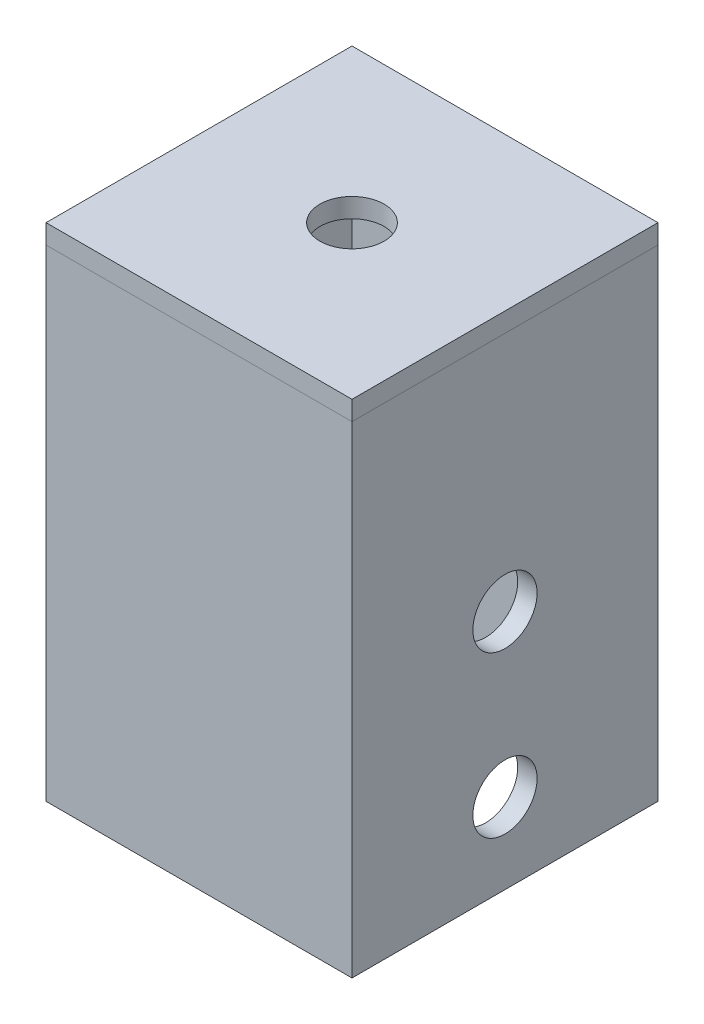
ISO-10303-21;
HEADER;
FILE_DESCRIPTION(('STEP AP214'),'2;1');
FILE_NAME('part.step','',(''),(''),'','','');
FILE_SCHEMA(('AUTOMOTIVE_DESIGN { 1 0 10303 214 1 1 1 1 }'));
ENDSEC;
DATA;
#1=APPLICATION_CONTEXT('core data for automotive mechanical design processes');
#2=APPLICATION_PROTOCOL_DEFINITION('international standard','automotive_design',2000,#1);
#3=PRODUCT_CONTEXT('',#1,'mechanical');
#4=PRODUCT('Part','Part','',(#3));
#5=PRODUCT_RELATED_PRODUCT_CATEGORY('part','',(#4));
#6=PRODUCT_DEFINITION_FORMATION('','',#4);
#7=PRODUCT_DEFINITION_CONTEXT('part definition',#1,'design');
#8=PRODUCT_DEFINITION('design','',#6,#7);
#9=PRODUCT_DEFINITION_SHAPE('','',#8);
#10=(LENGTH_UNIT() NAMED_UNIT(*) SI_UNIT(.MILLI.,.METRE.));
#11=(NAMED_UNIT(*) PLANE_ANGLE_UNIT() SI_UNIT($,.RADIAN.));
#12=(NAMED_UNIT(*) SI_UNIT($,.STERADIAN.) SOLID_ANGLE_UNIT());
#13=UNCERTAINTY_MEASURE_WITH_UNIT(LENGTH_MEASURE(1.E-05),#10,'distance_accuracy_value','');
#14=(GEOMETRIC_REPRESENTATION_CONTEXT(3) GLOBAL_UNCERTAINTY_ASSIGNED_CONTEXT((#13)) GLOBAL_UNIT_ASSIGNED_CONTEXT((#10,
#11,#12)) REPRESENTATION_CONTEXT('',''));
#15=CARTESIAN_POINT('',(0.,0.,0.));
#16=DIRECTION('',(0.,0.,1.));
#17=DIRECTION('',(1.,0.,0.));
#18=AXIS2_PLACEMENT_3D('',#15,#16,#17);
#19=CARTESIAN_POINT('',(19.05,62.41,-19.05));
#20=DIRECTION('',(0.,0.,1.));
#21=DIRECTION('',(1.,0.,0.));
#22=AXIS2_PLACEMENT_3D('',#19,#20,#21);
#23=PLANE('',#22);
#24=DIRECTION('',(-1.,0.,0.));
#25=VECTOR('',#24,1.);
#26=CARTESIAN_POINT('',(19.05,60.,-19.05));
#27=LINE('',#26,#25);
#28=CARTESIAN_POINT('',(19.05,60.,-19.05));
#29=VERTEX_POINT('',#28);
#30=CARTESIAN_POINT('',(-19.05,60.,-19.05));
#31=VERTEX_POINT('',#30);
#32=EDGE_CURVE('E127',#29,#31,#27,.T.);
#33=ORIENTED_EDGE('',*,*,#32,.T.);
#34=DIRECTION('',(0.,-1.,0.));
#35=VECTOR('',#34,1.);
#36=CARTESIAN_POINT('',(-19.05,62.41,-19.05));
#37=LINE('',#36,#35);
#38=CARTESIAN_POINT('',(-19.05,62.41,-19.05));
#39=VERTEX_POINT('',#38);
#40=EDGE_CURVE('E13',#39,#31,#37,.T.);
#41=ORIENTED_EDGE('',*,*,#40,.F.);
#42=DIRECTION('',(-1.,0.,0.));
#43=VECTOR('',#42,1.);
#44=CARTESIAN_POINT('',(19.05,62.41,-19.05));
#45=LINE('',#44,#43);
#46=CARTESIAN_POINT('',(19.05,62.41,-19.05));
#47=VERTEX_POINT('',#46);
#48=EDGE_CURVE('E114',#47,#39,#45,.T.);
#49=ORIENTED_EDGE('',*,*,#48,.F.);
#50=DIRECTION('',(0.,-1.,0.));
#51=VECTOR('',#50,1.);
#52=CARTESIAN_POINT('',(19.05,62.41,-19.05));
#53=LINE('',#52,#51);
#54=EDGE_CURVE('E123',#47,#29,#53,.T.);
#55=ORIENTED_EDGE('',*,*,#54,.T.);
#56=EDGE_LOOP('',(#33,#41,#49,#55));
#57=FACE_BOUND('',#56,.T.);
#58=ADVANCED_FACE('F62',(#57),#23,.F.);
#59=CARTESIAN_POINT('',(-19.05,62.41,-19.05));
#60=DIRECTION('',(1.,0.,0.));
#61=DIRECTION('',(0.,0.,-1.));
#62=AXIS2_PLACEMENT_3D('',#59,#60,#61);
#63=PLANE('',#62);
#64=DIRECTION('',(0.,0.,1.));
#65=VECTOR('',#64,1.);
#66=CARTESIAN_POINT('',(-19.05,60.,-19.05));
#67=LINE('',#66,#65);
#68=CARTESIAN_POINT('',(-19.05,60.,19.05));
#69=VERTEX_POINT('',#68);
#70=EDGE_CURVE('E118',#31,#69,#67,.T.);
#71=ORIENTED_EDGE('',*,*,#70,.T.);
#72=DIRECTION('',(0.,-1.,0.));
#73=VECTOR('',#72,1.);
#74=CARTESIAN_POINT('',(-19.05,62.41,19.05));
#75=LINE('',#74,#73);
#76=CARTESIAN_POINT('',(-19.05,62.41,19.05));
#77=VERTEX_POINT('',#76);
#78=EDGE_CURVE('E71',#77,#69,#75,.T.);
#79=ORIENTED_EDGE('',*,*,#78,.F.);
#80=DIRECTION('',(0.,0.,1.));
#81=VECTOR('',#80,1.);
#82=CARTESIAN_POINT('',(-19.05,62.41,-19.05));
#83=LINE('',#82,#81);
#84=EDGE_CURVE('E109',#39,#77,#83,.T.);
#85=ORIENTED_EDGE('',*,*,#84,.F.);
#86=ORIENTED_EDGE('',*,*,#40,.T.);
#87=EDGE_LOOP('',(#71,#79,#85,#86));
#88=FACE_BOUND('',#87,.T.);
#89=ADVANCED_FACE('F117',(#88),#63,.F.);
#90=CARTESIAN_POINT('',(-19.05,62.41,19.05));
#91=DIRECTION('',(0.,0.,-1.));
#92=DIRECTION('',(-1.,0.,0.));
#93=AXIS2_PLACEMENT_3D('',#90,#91,#92);
#94=PLANE('',#93);
#95=DIRECTION('',(1.,0.,0.));
#96=VECTOR('',#95,1.);
#97=CARTESIAN_POINT('',(-19.05,60.,19.05));
#98=LINE('',#97,#96);
#99=CARTESIAN_POINT('',(19.05,60.,19.05));
#100=VERTEX_POINT('',#99);
#101=EDGE_CURVE('E96',#69,#100,#98,.T.);
#102=ORIENTED_EDGE('',*,*,#101,.T.);
#103=DIRECTION('',(0.,-1.,0.));
#104=VECTOR('',#103,1.);
#105=CARTESIAN_POINT('',(19.05,62.41,19.05));
#106=LINE('',#105,#104);
#107=CARTESIAN_POINT('',(19.05,62.41,19.05));
#108=VERTEX_POINT('',#107);
#109=EDGE_CURVE('E119',#108,#100,#106,.T.);
#110=ORIENTED_EDGE('',*,*,#109,.F.);
#111=DIRECTION('',(1.,0.,0.));
#112=VECTOR('',#111,1.);
#113=CARTESIAN_POINT('',(-19.05,62.41,19.05));
#114=LINE('',#113,#112);
#115=EDGE_CURVE('E112',#77,#108,#114,.T.);
#116=ORIENTED_EDGE('',*,*,#115,.F.);
#117=ORIENTED_EDGE('',*,*,#78,.T.);
#118=EDGE_LOOP('',(#102,#110,#116,#117));
#119=FACE_BOUND('',#118,.T.);
#120=ADVANCED_FACE('F121',(#119),#94,.F.);
#121=CARTESIAN_POINT('',(19.05,62.41,19.05));
#122=DIRECTION('',(-1.,0.,0.));
#123=DIRECTION('',(0.,0.,1.));
#124=AXIS2_PLACEMENT_3D('',#121,#122,#123);
#125=PLANE('',#124);
#126=DIRECTION('',(0.,0.,-1.));
#127=VECTOR('',#126,1.);
#128=CARTESIAN_POINT('',(19.05,60.,19.05));
#129=LINE('',#128,#127);
#130=EDGE_CURVE('E102',#100,#29,#129,.T.);
#131=ORIENTED_EDGE('',*,*,#130,.T.);
#132=ORIENTED_EDGE('',*,*,#54,.F.);
#133=DIRECTION('',(0.,0.,-1.));
#134=VECTOR('',#133,1.);
#135=CARTESIAN_POINT('',(19.05,62.41,19.05));
#136=LINE('',#135,#134);
#137=EDGE_CURVE('E79',#108,#47,#136,.T.);
#138=ORIENTED_EDGE('',*,*,#137,.F.);
#139=ORIENTED_EDGE('',*,*,#109,.T.);
#140=EDGE_LOOP('',(#131,#132,#138,#139));
#141=FACE_BOUND('',#140,.T.);
#142=ADVANCED_FACE('F134',(#141),#125,.F.);
#143=CARTESIAN_POINT('',(0.,62.41,0.));
#144=DIRECTION('',(0.,1.,0.));
#145=DIRECTION('',(0.,0.,1.));
#146=AXIS2_PLACEMENT_3D('',#143,#144,#145);
#147=PLANE('',#146);
#148=CARTESIAN_POINT('',(0.,62.41,0.));
#149=DIRECTION('',(0.,1.,0.));
#150=DIRECTION('',(0.,0.,1.));
#151=AXIS2_PLACEMENT_3D('',#148,#149,#150);
#152=CIRCLE('',#151,4.);
#153=CARTESIAN_POINT('',(0.,62.41,4.));
#154=VERTEX_POINT('',#153);
#155=EDGE_CURVE('E140',#154,#154,#152,.T.);
#156=ORIENTED_EDGE('',*,*,#155,.F.);
#157=EDGE_LOOP('',(#156));
#158=FACE_BOUND('',#157,.T.);
#159=ORIENTED_EDGE('',*,*,#48,.T.);
#160=ORIENTED_EDGE('',*,*,#84,.T.);
#161=ORIENTED_EDGE('',*,*,#115,.T.);
#162=ORIENTED_EDGE('',*,*,#137,.T.);
#163=EDGE_LOOP('',(#159,#160,#161,#162));
#164=FACE_BOUND('',#163,.T.);
#165=ADVANCED_FACE('F110',(#158,#164),#147,.T.);
#166=CARTESIAN_POINT('',(0.,60.,0.));
#167=DIRECTION('',(0.,1.,0.));
#168=DIRECTION('',(0.,0.,1.));
#169=AXIS2_PLACEMENT_3D('',#166,#167,#168);
#170=PLANE('',#169);
#171=CARTESIAN_POINT('',(0.,60.,0.));
#172=DIRECTION('',(0.,1.,0.));
#173=DIRECTION('',(0.,0.,1.));
#174=AXIS2_PLACEMENT_3D('',#171,#172,#173);
#175=CIRCLE('',#174,4.);
#176=CARTESIAN_POINT('',(0.,60.,4.));
#177=VERTEX_POINT('',#176);
#178=EDGE_CURVE('E65',#177,#177,#175,.T.);
#179=ORIENTED_EDGE('',*,*,#178,.T.);
#180=EDGE_LOOP('',(#179));
#181=FACE_BOUND('',#180,.T.);
#182=ORIENTED_EDGE('',*,*,#32,.F.);
#183=ORIENTED_EDGE('',*,*,#130,.F.);
#184=ORIENTED_EDGE('',*,*,#101,.F.);
#185=ORIENTED_EDGE('',*,*,#70,.F.);
#186=EDGE_LOOP('',(#182,#183,#184,#185));
#187=FACE_BOUND('',#186,.T.);
#188=ADVANCED_FACE('F137',(#181,#187),#170,.F.);
#189=CARTESIAN_POINT('',(0.,52.41,0.));
#190=DIRECTION('',(0.,1.,0.));
#191=DIRECTION('',(0.,0.,1.));
#192=AXIS2_PLACEMENT_3D('',#189,#190,#191);
#193=CYLINDRICAL_SURFACE('',#192,4.);
#194=ORIENTED_EDGE('',*,*,#155,.T.);
#195=EDGE_LOOP('',(#194));
#196=FACE_BOUND('',#195,.T.);
#197=ORIENTED_EDGE('',*,*,#178,.F.);
#198=EDGE_LOOP('',(#197));
#199=FACE_BOUND('',#198,.T.);
#200=ADVANCED_FACE('F148',(#196,#199),#193,.F.);
#201=CLOSED_SHELL('',(#58,#89,#120,#142,#165,#188,#200));
#202=MANIFOLD_SOLID_BREP('B2',#201);
#203=CARTESIAN_POINT('',(-19.05,60.,19.05));
#204=DIRECTION('',(1.,0.,0.));
#205=DIRECTION('',(0.,0.,-1.));
#206=AXIS2_PLACEMENT_3D('',#203,#204,#205);
#207=PLANE('',#206);
#208=CARTESIAN_POINT('',(-19.05,10.,0.));
#209=DIRECTION('',(1.,0.,0.));
#210=DIRECTION('',(0.,0.,-1.));
#211=AXIS2_PLACEMENT_3D('',#208,#209,#210);
#212=CIRCLE('',#211,4.);
#213=CARTESIAN_POINT('',(-19.05,10.,-4.00000000000001));
#214=VERTEX_POINT('',#213);
#215=EDGE_CURVE('E333',#214,#214,#212,.T.);
#216=ORIENTED_EDGE('',*,*,#215,.T.);
#217=EDGE_LOOP('',(#216));
#218=FACE_BOUND('',#217,.T.);
#219=CARTESIAN_POINT('',(-19.05,30.,0.));
#220=DIRECTION('',(1.,0.,0.));
#221=DIRECTION('',(0.,0.,-1.));
#222=AXIS2_PLACEMENT_3D('',#219,#220,#221);
#223=CIRCLE('',#222,4.);
#224=CARTESIAN_POINT('',(-19.05,30.,-4.00000000000001));
#225=VERTEX_POINT('',#224);
#226=EDGE_CURVE('E349',#225,#225,#223,.T.);
#227=ORIENTED_EDGE('',*,*,#226,.T.);
#228=EDGE_LOOP('',(#227));
#229=FACE_BOUND('',#228,.T.);
#230=DIRECTION('',(0.,0.,1.));
#231=VECTOR('',#230,1.);
#232=CARTESIAN_POINT('',(-19.05,0.,19.05));
#233=LINE('',#232,#231);
#234=CARTESIAN_POINT('',(-19.05,0.,-19.05));
#235=VERTEX_POINT('',#234);
#236=CARTESIAN_POINT('',(-19.05,0.,19.05));
#237=VERTEX_POINT('',#236);
#238=EDGE_CURVE('E315',#235,#237,#233,.T.);
#239=ORIENTED_EDGE('',*,*,#238,.T.);
#240=DIRECTION('',(0.,-1.,0.));
#241=VECTOR('',#240,1.);
#242=CARTESIAN_POINT('',(-19.05,60.,19.05));
#243=LINE('',#242,#241);
#244=CARTESIAN_POINT('',(-19.05,60.,19.05));
#245=VERTEX_POINT('',#244);
#246=EDGE_CURVE('E60',#245,#237,#243,.T.);
#247=ORIENTED_EDGE('',*,*,#246,.F.);
#248=DIRECTION('',(0.,0.,1.));
#249=VECTOR('',#248,1.);
#250=CARTESIAN_POINT('',(-19.05,60.,19.05));
#251=LINE('',#250,#249);
#252=CARTESIAN_POINT('',(-19.05,60.,-19.05));
#253=VERTEX_POINT('',#252);
#254=EDGE_CURVE('E288',#253,#245,#251,.T.);
#255=ORIENTED_EDGE('',*,*,#254,.F.);
#256=DIRECTION('',(0.,-1.,0.));
#257=VECTOR('',#256,1.);
#258=CARTESIAN_POINT('',(-19.05,60.,-19.05));
#259=LINE('',#258,#257);
#260=EDGE_CURVE('E322',#253,#235,#259,.T.);
#261=ORIENTED_EDGE('',*,*,#260,.T.);
#262=EDGE_LOOP('',(#239,#247,#255,#261));
#263=FACE_BOUND('',#262,.T.);
#264=ADVANCED_FACE('F206',(#218,#229,#263),#207,.F.);
#265=CARTESIAN_POINT('',(-19.05,60.,19.05));
#266=DIRECTION('',(0.,0.,-1.));
#267=DIRECTION('',(-1.,0.,0.));
#268=AXIS2_PLACEMENT_3D('',#265,#266,#267);
#269=PLANE('',#268);
#270=DIRECTION('',(1.,0.,0.));
#271=VECTOR('',#270,1.);
#272=CARTESIAN_POINT('',(-19.05,0.,19.05));
#273=LINE('',#272,#271);
#274=CARTESIAN_POINT('',(19.05,0.,19.05));
#275=VERTEX_POINT('',#274);
#276=EDGE_CURVE('E293',#237,#275,#273,.T.);
#277=ORIENTED_EDGE('',*,*,#276,.T.);
#278=DIRECTION('',(0.,-1.,0.));
#279=VECTOR('',#278,1.);
#280=CARTESIAN_POINT('',(19.05,60.,19.05));
#281=LINE('',#280,#279);
#282=CARTESIAN_POINT('',(19.05,60.,19.05));
#283=VERTEX_POINT('',#282);
#284=EDGE_CURVE('E216',#283,#275,#281,.T.);
#285=ORIENTED_EDGE('',*,*,#284,.F.);
#286=DIRECTION('',(1.,0.,0.));
#287=VECTOR('',#286,1.);
#288=CARTESIAN_POINT('',(-19.05,60.,19.05));
#289=LINE('',#288,#287);
#290=EDGE_CURVE('E282',#245,#283,#289,.T.);
#291=ORIENTED_EDGE('',*,*,#290,.F.);
#292=ORIENTED_EDGE('',*,*,#246,.T.);
#293=EDGE_LOOP('',(#277,#285,#291,#292));
#294=FACE_BOUND('',#293,.T.);
#295=ADVANCED_FACE('F292',(#294),#269,.F.);
#296=CARTESIAN_POINT('',(19.05,60.,-19.05));
#297=DIRECTION('',(-1.,0.,0.));
#298=DIRECTION('',(0.,0.,1.));
#299=AXIS2_PLACEMENT_3D('',#296,#297,#298);
#300=PLANE('',#299);
#301=CARTESIAN_POINT('',(19.05,10.,0.));
#302=DIRECTION('',(1.,0.,0.));
#303=DIRECTION('',(0.,0.,-1.));
#304=AXIS2_PLACEMENT_3D('',#301,#302,#303);
#305=CIRCLE('',#304,4.);
#306=CARTESIAN_POINT('',(19.05,10.,-3.99999999999999));
#307=VERTEX_POINT('',#306);
#308=EDGE_CURVE('E339',#307,#307,#305,.T.);
#309=ORIENTED_EDGE('',*,*,#308,.F.);
#310=EDGE_LOOP('',(#309));
#311=FACE_BOUND('',#310,.T.);
#312=CARTESIAN_POINT('',(19.05,30.,0.));
#313=DIRECTION('',(1.,0.,0.));
#314=DIRECTION('',(0.,0.,-1.));
#315=AXIS2_PLACEMENT_3D('',#312,#313,#314);
#316=CIRCLE('',#315,4.);
#317=CARTESIAN_POINT('',(19.05,30.,-3.99999999999999));
#318=VERTEX_POINT('',#317);
#319=EDGE_CURVE('E344',#318,#318,#316,.T.);
#320=ORIENTED_EDGE('',*,*,#319,.F.);
#321=EDGE_LOOP('',(#320));
#322=FACE_BOUND('',#321,.T.);
#323=DIRECTION('',(0.,0.,-1.));
#324=VECTOR('',#323,1.);
#325=CARTESIAN_POINT('',(19.05,0.,-19.05));
#326=LINE('',#325,#324);
#327=CARTESIAN_POINT('',(19.05,0.,-19.05));
#328=VERTEX_POINT('',#327);
#329=EDGE_CURVE('E254',#275,#328,#326,.T.);
#330=ORIENTED_EDGE('',*,*,#329,.T.);
#331=DIRECTION('',(0.,-1.,0.));
#332=VECTOR('',#331,1.);
#333=CARTESIAN_POINT('',(19.05,60.,-19.05));
#334=LINE('',#333,#332);
#335=CARTESIAN_POINT('',(19.05,60.,-19.05));
#336=VERTEX_POINT('',#335);
#337=EDGE_CURVE('E294',#336,#328,#334,.T.);
#338=ORIENTED_EDGE('',*,*,#337,.F.);
#339=DIRECTION('',(0.,0.,-1.));
#340=VECTOR('',#339,1.);
#341=CARTESIAN_POINT('',(19.05,60.,-19.05));
#342=LINE('',#341,#340);
#343=EDGE_CURVE('E286',#283,#336,#342,.T.);
#344=ORIENTED_EDGE('',*,*,#343,.F.);
#345=ORIENTED_EDGE('',*,*,#284,.T.);
#346=EDGE_LOOP('',(#330,#338,#344,#345));
#347=FACE_BOUND('',#346,.T.);
#348=ADVANCED_FACE('F296',(#311,#322,#347),#300,.F.);
#349=CARTESIAN_POINT('',(-16.637,60.,16.637));
#350=DIRECTION('',(0.,0.,-1.));
#351=DIRECTION('',(-1.,0.,0.));
#352=AXIS2_PLACEMENT_3D('',#349,#350,#351);
#353=PLANE('',#352);
#354=DIRECTION('',(1.,0.,0.));
#355=VECTOR('',#354,1.);
#356=CARTESIAN_POINT('',(-16.637,0.,16.637));
#357=LINE('',#356,#355);
#358=CARTESIAN_POINT('',(-16.637,0.,16.637));
#359=VERTEX_POINT('',#358);
#360=CARTESIAN_POINT('',(16.637,0.,16.637));
#361=VERTEX_POINT('',#360);
#362=EDGE_CURVE('E302',#359,#361,#357,.T.);
#363=ORIENTED_EDGE('',*,*,#362,.F.);
#364=DIRECTION('',(0.,-1.,0.));
#365=VECTOR('',#364,1.);
#366=CARTESIAN_POINT('',(-16.637,60.,16.637));
#367=LINE('',#366,#365);
#368=CARTESIAN_POINT('',(-16.637,60.,16.637));
#369=VERTEX_POINT('',#368);
#370=EDGE_CURVE('E268',#369,#359,#367,.T.);
#371=ORIENTED_EDGE('',*,*,#370,.F.);
#372=DIRECTION('',(1.,0.,0.));
#373=VECTOR('',#372,1.);
#374=CARTESIAN_POINT('',(-16.637,60.,16.637));
#375=LINE('',#374,#373);
#376=CARTESIAN_POINT('',(16.637,60.,16.637));
#377=VERTEX_POINT('',#376);
#378=EDGE_CURVE('E321',#369,#377,#375,.T.);
#379=ORIENTED_EDGE('',*,*,#378,.T.);
#380=DIRECTION('',(0.,-1.,0.));
#381=VECTOR('',#380,1.);
#382=CARTESIAN_POINT('',(16.637,60.,16.637));
#383=LINE('',#382,#381);
#384=EDGE_CURVE('E298',#377,#361,#383,.T.);
#385=ORIENTED_EDGE('',*,*,#384,.T.);
#386=EDGE_LOOP('',(#363,#371,#379,#385));
#387=FACE_BOUND('',#386,.T.);
#388=ADVANCED_FACE('F208',(#387),#353,.T.);
#389=CARTESIAN_POINT('',(-16.637,60.,16.637));
#390=DIRECTION('',(1.,0.,0.));
#391=DIRECTION('',(0.,0.,-1.));
#392=AXIS2_PLACEMENT_3D('',#389,#390,#391);
#393=PLANE('',#392);
#394=CARTESIAN_POINT('',(-16.637,10.,0.));
#395=DIRECTION('',(1.,0.,0.));
#396=DIRECTION('',(0.,0.,-1.));
#397=AXIS2_PLACEMENT_3D('',#394,#395,#396);
#398=CIRCLE('',#397,4.);
#399=CARTESIAN_POINT('',(-16.637,10.,-4.00000000000001));
#400=VERTEX_POINT('',#399);
#401=EDGE_CURVE('E306',#400,#400,#398,.T.);
#402=ORIENTED_EDGE('',*,*,#401,.F.);
#403=EDGE_LOOP('',(#402));
#404=FACE_BOUND('',#403,.T.);
#405=CARTESIAN_POINT('',(-16.637,30.,0.));
#406=DIRECTION('',(1.,0.,0.));
#407=DIRECTION('',(0.,0.,-1.));
#408=AXIS2_PLACEMENT_3D('',#405,#406,#407);
#409=CIRCLE('',#408,4.);
#410=CARTESIAN_POINT('',(-16.637,30.,-4.00000000000001));
#411=VERTEX_POINT('',#410);
#412=EDGE_CURVE('E332',#411,#411,#409,.T.);
#413=ORIENTED_EDGE('',*,*,#412,.F.);
#414=EDGE_LOOP('',(#413));
#415=FACE_BOUND('',#414,.T.);
#416=DIRECTION('',(0.,0.,1.));
#417=VECTOR('',#416,1.);
#418=CARTESIAN_POINT('',(-16.637,0.,16.637));
#419=LINE('',#418,#417);
#420=CARTESIAN_POINT('',(-16.637,0.,-16.637));
#421=VERTEX_POINT('',#420);
#422=EDGE_CURVE('E305',#421,#359,#419,.T.);
#423=ORIENTED_EDGE('',*,*,#422,.F.);
#424=DIRECTION('',(0.,-1.,0.));
#425=VECTOR('',#424,1.);
#426=CARTESIAN_POINT('',(-16.637,60.,-16.637));
#427=LINE('',#426,#425);
#428=CARTESIAN_POINT('',(-16.637,60.,-16.637));
#429=VERTEX_POINT('',#428);
#430=EDGE_CURVE('E328',#429,#421,#427,.T.);
#431=ORIENTED_EDGE('',*,*,#430,.F.);
#432=DIRECTION('',(0.,0.,1.));
#433=VECTOR('',#432,1.);
#434=CARTESIAN_POINT('',(-16.637,60.,16.637));
#435=LINE('',#434,#433);
#436=EDGE_CURVE('E355',#429,#369,#435,.T.);
#437=ORIENTED_EDGE('',*,*,#436,.T.);
#438=ORIENTED_EDGE('',*,*,#370,.T.);
#439=EDGE_LOOP('',(#423,#431,#437,#438));
#440=FACE_BOUND('',#439,.T.);
#441=ADVANCED_FACE('F378',(#404,#415,#440),#393,.T.);
#442=CARTESIAN_POINT('',(16.637,60.,-16.637));
#443=DIRECTION('',(0.,0.,1.));
#444=DIRECTION('',(1.,0.,0.));
#445=AXIS2_PLACEMENT_3D('',#442,#443,#444);
#446=PLANE('',#445);
#447=DIRECTION('',(-1.,0.,0.));
#448=VECTOR('',#447,1.);
#449=CARTESIAN_POINT('',(16.637,0.,-16.637));
#450=LINE('',#449,#448);
#451=CARTESIAN_POINT('',(16.637,0.,-16.637));
#452=VERTEX_POINT('',#451);
#453=EDGE_CURVE('E309',#452,#421,#450,.T.);
#454=ORIENTED_EDGE('',*,*,#453,.F.);
#455=DIRECTION('',(0.,-1.,0.));
#456=VECTOR('',#455,1.);
#457=CARTESIAN_POINT('',(16.637,60.,-16.637));
#458=LINE('',#457,#456);
#459=CARTESIAN_POINT('',(16.637,60.,-16.637));
#460=VERTEX_POINT('',#459);
#461=EDGE_CURVE('E326',#460,#452,#458,.T.);
#462=ORIENTED_EDGE('',*,*,#461,.F.);
#463=DIRECTION('',(-1.,0.,0.));
#464=VECTOR('',#463,1.);
#465=CARTESIAN_POINT('',(16.637,60.,-16.637));
#466=LINE('',#465,#464);
#467=EDGE_CURVE('E358',#460,#429,#466,.T.);
#468=ORIENTED_EDGE('',*,*,#467,.T.);
#469=ORIENTED_EDGE('',*,*,#430,.T.);
#470=EDGE_LOOP('',(#454,#462,#468,#469));
#471=FACE_BOUND('',#470,.T.);
#472=ADVANCED_FACE('F372',(#471),#446,.T.);
#473=CARTESIAN_POINT('',(16.637,60.,-16.637));
#474=DIRECTION('',(-1.,0.,0.));
#475=DIRECTION('',(0.,0.,1.));
#476=AXIS2_PLACEMENT_3D('',#473,#474,#475);
#477=PLANE('',#476);
#478=CARTESIAN_POINT('',(16.637,10.,0.));
#479=DIRECTION('',(-1.,0.,0.));
#480=DIRECTION('',(0.,0.,1.));
#481=AXIS2_PLACEMENT_3D('',#478,#479,#480);
#482=CIRCLE('',#481,4.);
#483=CARTESIAN_POINT('',(16.637,10.,4.00000000000001));
#484=VERTEX_POINT('',#483);
#485=EDGE_CURVE('E210',#484,#484,#482,.T.);
#486=ORIENTED_EDGE('',*,*,#485,.F.);
#487=EDGE_LOOP('',(#486));
#488=FACE_BOUND('',#487,.T.);
#489=CARTESIAN_POINT('',(16.637,30.,0.));
#490=DIRECTION('',(-1.,0.,0.));
#491=DIRECTION('',(0.,0.,1.));
#492=AXIS2_PLACEMENT_3D('',#489,#490,#491);
#493=CIRCLE('',#492,4.);
#494=CARTESIAN_POINT('',(16.637,30.,4.00000000000001));
#495=VERTEX_POINT('',#494);
#496=EDGE_CURVE('E330',#495,#495,#493,.T.);
#497=ORIENTED_EDGE('',*,*,#496,.F.);
#498=EDGE_LOOP('',(#497));
#499=FACE_BOUND('',#498,.T.);
#500=DIRECTION('',(0.,0.,-1.));
#501=VECTOR('',#500,1.);
#502=CARTESIAN_POINT('',(16.637,0.,-16.637));
#503=LINE('',#502,#501);
#504=EDGE_CURVE('E312',#361,#452,#503,.T.);
#505=ORIENTED_EDGE('',*,*,#504,.F.);
#506=ORIENTED_EDGE('',*,*,#384,.F.);
#507=DIRECTION('',(0.,0.,-1.));
#508=VECTOR('',#507,1.);
#509=CARTESIAN_POINT('',(16.637,60.,-16.637));
#510=LINE('',#509,#508);
#511=EDGE_CURVE('E361',#377,#460,#510,.T.);
#512=ORIENTED_EDGE('',*,*,#511,.T.);
#513=ORIENTED_EDGE('',*,*,#461,.T.);
#514=EDGE_LOOP('',(#505,#506,#512,#513));
#515=FACE_BOUND('',#514,.T.);
#516=ADVANCED_FACE('F366',(#488,#499,#515),#477,.T.);
#517=CARTESIAN_POINT('',(19.05,60.,-19.05));
#518=DIRECTION('',(0.,0.,1.));
#519=DIRECTION('',(1.,0.,0.));
#520=AXIS2_PLACEMENT_3D('',#517,#518,#519);
#521=PLANE('',#520);
#522=DIRECTION('',(-1.,0.,0.));
#523=VECTOR('',#522,1.);
#524=CARTESIAN_POINT('',(19.05,0.,-19.05));
#525=LINE('',#524,#523);
#526=EDGE_CURVE('E260',#328,#235,#525,.T.);
#527=ORIENTED_EDGE('',*,*,#526,.T.);
#528=ORIENTED_EDGE('',*,*,#260,.F.);
#529=DIRECTION('',(-1.,0.,0.));
#530=VECTOR('',#529,1.);
#531=CARTESIAN_POINT('',(19.05,60.,-19.05));
#532=LINE('',#531,#530);
#533=EDGE_CURVE('E225',#336,#253,#532,.T.);
#534=ORIENTED_EDGE('',*,*,#533,.F.);
#535=ORIENTED_EDGE('',*,*,#337,.T.);
#536=EDGE_LOOP('',(#527,#528,#534,#535));
#537=FACE_BOUND('',#536,.T.);
#538=ADVANCED_FACE('F396',(#537),#521,.F.);
#539=CARTESIAN_POINT('',(0.,60.,0.));
#540=DIRECTION('',(0.,1.,0.));
#541=DIRECTION('',(0.,0.,1.));
#542=AXIS2_PLACEMENT_3D('',#539,#540,#541);
#543=PLANE('',#542);
#544=ORIENTED_EDGE('',*,*,#378,.F.);
#545=ORIENTED_EDGE('',*,*,#436,.F.);
#546=ORIENTED_EDGE('',*,*,#467,.F.);
#547=ORIENTED_EDGE('',*,*,#511,.F.);
#548=EDGE_LOOP('',(#544,#545,#546,#547));
#549=FACE_BOUND('',#548,.T.);
#550=ORIENTED_EDGE('',*,*,#254,.T.);
#551=ORIENTED_EDGE('',*,*,#290,.T.);
#552=ORIENTED_EDGE('',*,*,#343,.T.);
#553=ORIENTED_EDGE('',*,*,#533,.T.);
#554=EDGE_LOOP('',(#550,#551,#552,#553));
#555=FACE_BOUND('',#554,.T.);
#556=ADVANCED_FACE('F284',(#549,#555),#543,.T.);
#557=CARTESIAN_POINT('',(0.,0.,0.));
#558=DIRECTION('',(0.,1.,0.));
#559=DIRECTION('',(0.,0.,1.));
#560=AXIS2_PLACEMENT_3D('',#557,#558,#559);
#561=PLANE('',#560);
#562=ORIENTED_EDGE('',*,*,#362,.T.);
#563=ORIENTED_EDGE('',*,*,#504,.T.);
#564=ORIENTED_EDGE('',*,*,#453,.T.);
#565=ORIENTED_EDGE('',*,*,#422,.T.);
#566=EDGE_LOOP('',(#562,#563,#564,#565));
#567=FACE_BOUND('',#566,.T.);
#568=ORIENTED_EDGE('',*,*,#238,.F.);
#569=ORIENTED_EDGE('',*,*,#526,.F.);
#570=ORIENTED_EDGE('',*,*,#329,.F.);
#571=ORIENTED_EDGE('',*,*,#276,.F.);
#572=EDGE_LOOP('',(#568,#569,#570,#571));
#573=FACE_BOUND('',#572,.T.);
#574=ADVANCED_FACE('F375',(#567,#573),#561,.F.);
#575=CARTESIAN_POINT('',(-19.05,30.,0.));
#576=DIRECTION('',(1.,0.,0.));
#577=DIRECTION('',(0.,0.,-1.));
#578=AXIS2_PLACEMENT_3D('',#575,#576,#577);
#579=CYLINDRICAL_SURFACE('',#578,4.);
#580=ORIENTED_EDGE('',*,*,#496,.T.);
#581=EDGE_LOOP('',(#580));
#582=FACE_BOUND('',#581,.T.);
#583=ORIENTED_EDGE('',*,*,#319,.T.);
#584=EDGE_LOOP('',(#583));
#585=FACE_BOUND('',#584,.T.);
#586=ADVANCED_FACE('F426',(#582,#585),#579,.F.);
#587=CARTESIAN_POINT('',(-19.05,10.,0.));
#588=DIRECTION('',(1.,0.,0.));
#589=DIRECTION('',(0.,0.,-1.));
#590=AXIS2_PLACEMENT_3D('',#587,#588,#589);
#591=CYLINDRICAL_SURFACE('',#590,4.);
#592=ORIENTED_EDGE('',*,*,#485,.T.);
#593=EDGE_LOOP('',(#592));
#594=FACE_BOUND('',#593,.T.);
#595=ORIENTED_EDGE('',*,*,#308,.T.);
#596=EDGE_LOOP('',(#595));
#597=FACE_BOUND('',#596,.T.);
#598=ADVANCED_FACE('F432',(#594,#597),#591,.F.);
#599=ORIENTED_EDGE('',*,*,#412,.T.);
#600=EDGE_LOOP('',(#599));
#601=FACE_BOUND('',#600,.T.);
#602=ORIENTED_EDGE('',*,*,#226,.F.);
#603=EDGE_LOOP('',(#602));
#604=FACE_BOUND('',#603,.T.);
#605=ADVANCED_FACE('F434',(#601,#604),#579,.F.);
#606=ORIENTED_EDGE('',*,*,#401,.T.);
#607=EDGE_LOOP('',(#606));
#608=FACE_BOUND('',#607,.T.);
#609=ORIENTED_EDGE('',*,*,#215,.F.);
#610=EDGE_LOOP('',(#609));
#611=FACE_BOUND('',#610,.T.);
#612=ADVANCED_FACE('F442',(#608,#611),#591,.F.);
#613=CLOSED_SHELL('',(#264,#295,#348,#388,#441,#472,#516,#538,#556,#574,#586,#598,#605,#612));
#614=MANIFOLD_SOLID_BREP('B7',#613);
#615=ADVANCED_BREP_SHAPE_REPRESENTATION('',(#18,#202,#614),#14);
#616=SHAPE_DEFINITION_REPRESENTATION(#9,#615);
ENDSEC;
END-ISO-10303-21;
